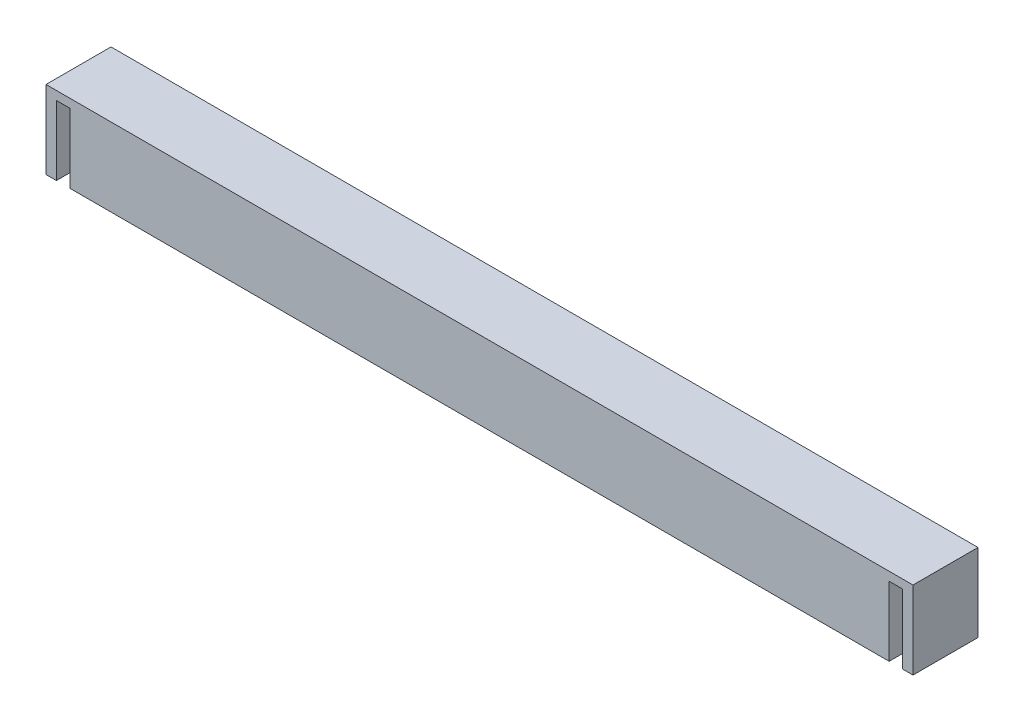
ISO-10303-21;
HEADER;
FILE_DESCRIPTION(('STEP AP214'),'2;1');
FILE_NAME('part.step','',(''),(''),'','','');
FILE_SCHEMA(('AUTOMOTIVE_DESIGN { 1 0 10303 214 1 1 1 1 }'));
ENDSEC;
DATA;
#1=APPLICATION_CONTEXT('core data for automotive mechanical design processes');
#2=APPLICATION_PROTOCOL_DEFINITION('international standard','automotive_design',2000,#1);
#3=PRODUCT_CONTEXT('',#1,'mechanical');
#4=PRODUCT('Part','Part','',(#3));
#5=PRODUCT_RELATED_PRODUCT_CATEGORY('part','',(#4));
#6=PRODUCT_DEFINITION_FORMATION('','',#4);
#7=PRODUCT_DEFINITION_CONTEXT('part definition',#1,'design');
#8=PRODUCT_DEFINITION('design','',#6,#7);
#9=PRODUCT_DEFINITION_SHAPE('','',#8);
#10=(LENGTH_UNIT() NAMED_UNIT(*) SI_UNIT(.MILLI.,.METRE.));
#11=(NAMED_UNIT(*) PLANE_ANGLE_UNIT() SI_UNIT($,.RADIAN.));
#12=(NAMED_UNIT(*) SI_UNIT($,.STERADIAN.) SOLID_ANGLE_UNIT());
#13=UNCERTAINTY_MEASURE_WITH_UNIT(LENGTH_MEASURE(1.E-05),#10,'distance_accuracy_value','');
#14=(GEOMETRIC_REPRESENTATION_CONTEXT(3) GLOBAL_UNCERTAINTY_ASSIGNED_CONTEXT((#13)) GLOBAL_UNIT_ASSIGNED_CONTEXT((#10,
#11,#12)) REPRESENTATION_CONTEXT('',''));
#15=CARTESIAN_POINT('',(0.,0.,0.));
#16=DIRECTION('',(0.,0.,1.));
#17=DIRECTION('',(1.,0.,0.));
#18=AXIS2_PLACEMENT_3D('',#15,#16,#17);
#19=CARTESIAN_POINT('',(-97.6,16.,7.5));
#20=DIRECTION('',(-1.,0.,0.));
#21=DIRECTION('',(0.,0.,1.));
#22=AXIS2_PLACEMENT_3D('',#19,#20,#21);
#23=PLANE('',#22);
#24=DIRECTION('',(0.,0.,-1.));
#25=VECTOR('',#24,1.);
#26=CARTESIAN_POINT('',(-97.6,0.,7.5));
#27=LINE('',#26,#25);
#28=CARTESIAN_POINT('',(-97.6,0.,7.5));
#29=VERTEX_POINT('',#28);
#30=CARTESIAN_POINT('',(-97.6,0.,2.5));
#31=VERTEX_POINT('',#30);
#32=EDGE_CURVE('E56',#29,#31,#27,.T.);
#33=ORIENTED_EDGE('',*,*,#32,.T.);
#34=DIRECTION('',(0.,1.,0.));
#35=VECTOR('',#34,1.);
#36=CARTESIAN_POINT('',(-97.6,16.,2.5));
#37=LINE('',#36,#35);
#38=CARTESIAN_POINT('',(-97.6,16.,2.5));
#39=VERTEX_POINT('',#38);
#40=EDGE_CURVE('E281',#31,#39,#37,.T.);
#41=ORIENTED_EDGE('',*,*,#40,.T.);
#42=DIRECTION('',(0.,0.,-1.));
#43=VECTOR('',#42,1.);
#44=CARTESIAN_POINT('',(-97.6,16.,7.5));
#45=LINE('',#44,#43);
#46=CARTESIAN_POINT('',(-97.6,16.,7.5));
#47=VERTEX_POINT('',#46);
#48=EDGE_CURVE('E256',#47,#39,#45,.T.);
#49=ORIENTED_EDGE('',*,*,#48,.F.);
#50=DIRECTION('',(0.,-1.,0.));
#51=VECTOR('',#50,1.);
#52=CARTESIAN_POINT('',(-97.6,16.,7.5));
#53=LINE('',#52,#51);
#54=EDGE_CURVE('E224',#47,#29,#53,.T.);
#55=ORIENTED_EDGE('',*,*,#54,.T.);
#56=EDGE_LOOP('',(#33,#41,#49,#55));
#57=FACE_BOUND('',#56,.T.);
#58=ADVANCED_FACE('F33',(#57),#23,.F.);
#59=CARTESIAN_POINT('',(-94.5,16.,7.5));
#60=DIRECTION('',(1.,0.,0.));
#61=DIRECTION('',(0.,0.,-1.));
#62=AXIS2_PLACEMENT_3D('',#59,#60,#61);
#63=PLANE('',#62);
#64=DIRECTION('',(0.,0.,1.));
#65=VECTOR('',#64,1.);
#66=CARTESIAN_POINT('',(-94.5,16.,7.5));
#67=LINE('',#66,#65);
#68=CARTESIAN_POINT('',(-94.5,16.,2.5));
#69=VERTEX_POINT('',#68);
#70=CARTESIAN_POINT('',(-94.5,16.,7.5));
#71=VERTEX_POINT('',#70);
#72=EDGE_CURVE('E252',#69,#71,#67,.T.);
#73=ORIENTED_EDGE('',*,*,#72,.F.);
#74=DIRECTION('',(0.,-1.,0.));
#75=VECTOR('',#74,1.);
#76=CARTESIAN_POINT('',(-94.5,16.,2.5));
#77=LINE('',#76,#75);
#78=CARTESIAN_POINT('',(-94.5,0.,2.5));
#79=VERTEX_POINT('',#78);
#80=EDGE_CURVE('E283',#69,#79,#77,.T.);
#81=ORIENTED_EDGE('',*,*,#80,.T.);
#82=DIRECTION('',(0.,0.,1.));
#83=VECTOR('',#82,1.);
#84=CARTESIAN_POINT('',(-94.5,0.,7.5));
#85=LINE('',#84,#83);
#86=CARTESIAN_POINT('',(-94.5,0.,7.5));
#87=VERTEX_POINT('',#86);
#88=EDGE_CURVE('E245',#79,#87,#85,.T.);
#89=ORIENTED_EDGE('',*,*,#88,.T.);
#90=DIRECTION('',(0.,-1.,0.));
#91=VECTOR('',#90,1.);
#92=CARTESIAN_POINT('',(-94.5,16.,7.5));
#93=LINE('',#92,#91);
#94=EDGE_CURVE('E238',#71,#87,#93,.T.);
#95=ORIENTED_EDGE('',*,*,#94,.F.);
#96=EDGE_LOOP('',(#73,#81,#89,#95));
#97=FACE_BOUND('',#96,.T.);
#98=ADVANCED_FACE('F323',(#97),#63,.F.);
#99=CARTESIAN_POINT('',(0.,16.,0.));
#100=DIRECTION('',(0.,-1.,0.));
#101=DIRECTION('',(0.,0.,-1.));
#102=AXIS2_PLACEMENT_3D('',#99,#100,#101);
#103=PLANE('',#102);
#104=DIRECTION('',(-1.,0.,0.));
#105=VECTOR('',#104,1.);
#106=CARTESIAN_POINT('',(0.,16.,2.5));
#107=LINE('',#106,#105);
#108=EDGE_CURVE('E285',#69,#39,#107,.T.);
#109=ORIENTED_EDGE('',*,*,#108,.F.);
#110=ORIENTED_EDGE('',*,*,#72,.T.);
#111=DIRECTION('',(-1.,0.,0.));
#112=VECTOR('',#111,1.);
#113=CARTESIAN_POINT('',(-97.6,16.,7.5));
#114=LINE('',#113,#112);
#115=EDGE_CURVE('E235',#71,#47,#114,.T.);
#116=ORIENTED_EDGE('',*,*,#115,.T.);
#117=ORIENTED_EDGE('',*,*,#48,.T.);
#118=EDGE_LOOP('',(#109,#110,#116,#117));
#119=FACE_BOUND('',#118,.T.);
#120=ADVANCED_FACE('F330',(#119),#103,.T.);
#121=CARTESIAN_POINT('',(94.5,16.,7.5));
#122=DIRECTION('',(-1.,0.,0.));
#123=DIRECTION('',(0.,0.,1.));
#124=AXIS2_PLACEMENT_3D('',#121,#122,#123);
#125=PLANE('',#124);
#126=DIRECTION('',(0.,0.,-1.));
#127=VECTOR('',#126,1.);
#128=CARTESIAN_POINT('',(94.5,0.,7.5));
#129=LINE('',#128,#127);
#130=CARTESIAN_POINT('',(94.5,0.,7.5));
#131=VERTEX_POINT('',#130);
#132=CARTESIAN_POINT('',(94.5,0.,2.5));
#133=VERTEX_POINT('',#132);
#134=EDGE_CURVE('E272',#131,#133,#129,.T.);
#135=ORIENTED_EDGE('',*,*,#134,.T.);
#136=DIRECTION('',(0.,1.,0.));
#137=VECTOR('',#136,1.);
#138=CARTESIAN_POINT('',(94.5,16.,2.5));
#139=LINE('',#138,#137);
#140=CARTESIAN_POINT('',(94.5,16.,2.5));
#141=VERTEX_POINT('',#140);
#142=EDGE_CURVE('E288',#133,#141,#139,.T.);
#143=ORIENTED_EDGE('',*,*,#142,.T.);
#144=DIRECTION('',(0.,0.,-1.));
#145=VECTOR('',#144,1.);
#146=CARTESIAN_POINT('',(94.5,16.,7.5));
#147=LINE('',#146,#145);
#148=CARTESIAN_POINT('',(94.5,16.,7.5));
#149=VERTEX_POINT('',#148);
#150=EDGE_CURVE('E278',#149,#141,#147,.T.);
#151=ORIENTED_EDGE('',*,*,#150,.F.);
#152=DIRECTION('',(0.,-1.,0.));
#153=VECTOR('',#152,1.);
#154=CARTESIAN_POINT('',(94.5,16.,7.5));
#155=LINE('',#154,#153);
#156=EDGE_CURVE('E267',#149,#131,#155,.T.);
#157=ORIENTED_EDGE('',*,*,#156,.T.);
#158=EDGE_LOOP('',(#135,#143,#151,#157));
#159=FACE_BOUND('',#158,.T.);
#160=ADVANCED_FACE('F372',(#159),#125,.F.);
#161=CARTESIAN_POINT('',(97.6,16.,7.5));
#162=DIRECTION('',(1.,0.,0.));
#163=DIRECTION('',(0.,0.,-1.));
#164=AXIS2_PLACEMENT_3D('',#161,#162,#163);
#165=PLANE('',#164);
#166=DIRECTION('',(0.,0.,1.));
#167=VECTOR('',#166,1.);
#168=CARTESIAN_POINT('',(97.6,16.,7.5));
#169=LINE('',#168,#167);
#170=CARTESIAN_POINT('',(97.6,16.,2.5));
#171=VERTEX_POINT('',#170);
#172=CARTESIAN_POINT('',(97.6,16.,7.5));
#173=VERTEX_POINT('',#172);
#174=EDGE_CURVE('E180',#171,#173,#169,.T.);
#175=ORIENTED_EDGE('',*,*,#174,.F.);
#176=DIRECTION('',(0.,-1.,0.));
#177=VECTOR('',#176,1.);
#178=CARTESIAN_POINT('',(97.6,16.,2.5));
#179=LINE('',#178,#177);
#180=CARTESIAN_POINT('',(97.6,0.,2.5));
#181=VERTEX_POINT('',#180);
#182=EDGE_CURVE('E290',#171,#181,#179,.T.);
#183=ORIENTED_EDGE('',*,*,#182,.T.);
#184=DIRECTION('',(0.,0.,1.));
#185=VECTOR('',#184,1.);
#186=CARTESIAN_POINT('',(97.6,0.,7.5));
#187=LINE('',#186,#185);
#188=CARTESIAN_POINT('',(97.6,0.,7.5));
#189=VERTEX_POINT('',#188);
#190=EDGE_CURVE('E271',#181,#189,#187,.T.);
#191=ORIENTED_EDGE('',*,*,#190,.T.);
#192=DIRECTION('',(0.,-1.,0.));
#193=VECTOR('',#192,1.);
#194=CARTESIAN_POINT('',(97.6,16.,7.5));
#195=LINE('',#194,#193);
#196=EDGE_CURVE('E264',#173,#189,#195,.T.);
#197=ORIENTED_EDGE('',*,*,#196,.F.);
#198=EDGE_LOOP('',(#175,#183,#191,#197));
#199=FACE_BOUND('',#198,.T.);
#200=ADVANCED_FACE('F377',(#199),#165,.F.);
#201=CARTESIAN_POINT('',(0.,16.,0.));
#202=DIRECTION('',(0.,-1.,0.));
#203=DIRECTION('',(0.,0.,-1.));
#204=AXIS2_PLACEMENT_3D('',#201,#202,#203);
#205=PLANE('',#204);
#206=DIRECTION('',(-1.,0.,0.));
#207=VECTOR('',#206,1.);
#208=CARTESIAN_POINT('',(0.,16.,2.5));
#209=LINE('',#208,#207);
#210=EDGE_CURVE('E11',#171,#141,#209,.T.);
#211=ORIENTED_EDGE('',*,*,#210,.F.);
#212=ORIENTED_EDGE('',*,*,#174,.T.);
#213=DIRECTION('',(-1.,0.,0.));
#214=VECTOR('',#213,1.);
#215=CARTESIAN_POINT('',(94.5,16.,7.5));
#216=LINE('',#215,#214);
#217=EDGE_CURVE('E179',#173,#149,#216,.T.);
#218=ORIENTED_EDGE('',*,*,#217,.T.);
#219=ORIENTED_EDGE('',*,*,#150,.T.);
#220=EDGE_LOOP('',(#211,#212,#218,#219));
#221=FACE_BOUND('',#220,.T.);
#222=ADVANCED_FACE('F382',(#221),#205,.T.);
#223=CARTESIAN_POINT('',(100.,18.,-7.5));
#224=DIRECTION('',(-1.,0.,0.));
#225=DIRECTION('',(0.,0.,1.));
#226=AXIS2_PLACEMENT_3D('',#223,#224,#225);
#227=PLANE('',#226);
#228=DIRECTION('',(0.,-1.,0.));
#229=VECTOR('',#228,1.);
#230=CARTESIAN_POINT('',(100.,18.,-7.5));
#231=LINE('',#230,#229);
#232=CARTESIAN_POINT('',(100.,18.,-7.5));
#233=VERTEX_POINT('',#232);
#234=CARTESIAN_POINT('',(100.,0.,-7.5));
#235=VERTEX_POINT('',#234);
#236=EDGE_CURVE('E195',#233,#235,#231,.T.);
#237=ORIENTED_EDGE('',*,*,#236,.F.);
#238=DIRECTION('',(0.,0.,-1.));
#239=VECTOR('',#238,1.);
#240=CARTESIAN_POINT('',(100.,18.,-7.5));
#241=LINE('',#240,#239);
#242=CARTESIAN_POINT('',(100.,18.,7.5));
#243=VERTEX_POINT('',#242);
#244=EDGE_CURVE('E212',#243,#233,#241,.T.);
#245=ORIENTED_EDGE('',*,*,#244,.F.);
#246=DIRECTION('',(0.,-1.,0.));
#247=VECTOR('',#246,1.);
#248=CARTESIAN_POINT('',(100.,18.,7.5));
#249=LINE('',#248,#247);
#250=CARTESIAN_POINT('',(100.,0.,7.5));
#251=VERTEX_POINT('',#250);
#252=EDGE_CURVE('E205',#243,#251,#249,.T.);
#253=ORIENTED_EDGE('',*,*,#252,.T.);
#254=DIRECTION('',(0.,0.,-1.));
#255=VECTOR('',#254,1.);
#256=CARTESIAN_POINT('',(100.,0.,-7.5));
#257=LINE('',#256,#255);
#258=EDGE_CURVE('E222',#251,#235,#257,.T.);
#259=ORIENTED_EDGE('',*,*,#258,.T.);
#260=EDGE_LOOP('',(#237,#245,#253,#259));
#261=FACE_BOUND('',#260,.T.);
#262=ADVANCED_FACE('F35',(#261),#227,.F.);
#263=CARTESIAN_POINT('',(-100.,18.,-7.5));
#264=DIRECTION('',(0.,0.,1.));
#265=DIRECTION('',(1.,0.,0.));
#266=AXIS2_PLACEMENT_3D('',#263,#264,#265);
#267=PLANE('',#266);
#268=DIRECTION('',(1.,0.,0.));
#269=VECTOR('',#268,1.);
#270=CARTESIAN_POINT('',(94.5,16.,-7.5));
#271=LINE('',#270,#269);
#272=CARTESIAN_POINT('',(94.5,16.,-7.5));
#273=VERTEX_POINT('',#272);
#274=CARTESIAN_POINT('',(97.6,16.,-7.5));
#275=VERTEX_POINT('',#274);
#276=EDGE_CURVE('E176',#273,#275,#271,.T.);
#277=ORIENTED_EDGE('',*,*,#276,.F.);
#278=DIRECTION('',(0.,-1.,0.));
#279=VECTOR('',#278,1.);
#280=CARTESIAN_POINT('',(94.5,16.,-7.5));
#281=LINE('',#280,#279);
#282=CARTESIAN_POINT('',(94.5,0.,-7.5));
#283=VERTEX_POINT('',#282);
#284=EDGE_CURVE('E259',#273,#283,#281,.T.);
#285=ORIENTED_EDGE('',*,*,#284,.T.);
#286=DIRECTION('',(-1.,0.,0.));
#287=VECTOR('',#286,1.);
#288=CARTESIAN_POINT('',(-100.,0.,-7.5));
#289=LINE('',#288,#287);
#290=CARTESIAN_POINT('',(-94.5,0.,-7.5));
#291=VERTEX_POINT('',#290);
#292=EDGE_CURVE('E220',#283,#291,#289,.T.);
#293=ORIENTED_EDGE('',*,*,#292,.T.);
#294=DIRECTION('',(0.,-1.,0.));
#295=VECTOR('',#294,1.);
#296=CARTESIAN_POINT('',(-94.5,16.,-7.5));
#297=LINE('',#296,#295);
#298=CARTESIAN_POINT('',(-94.5,16.,-7.5));
#299=VERTEX_POINT('',#298);
#300=EDGE_CURVE('E234',#299,#291,#297,.T.);
#301=ORIENTED_EDGE('',*,*,#300,.F.);
#302=DIRECTION('',(1.,0.,0.));
#303=VECTOR('',#302,1.);
#304=CARTESIAN_POINT('',(-97.6,16.,-7.5));
#305=LINE('',#304,#303);
#306=CARTESIAN_POINT('',(-97.6,16.,-7.5));
#307=VERTEX_POINT('',#306);
#308=EDGE_CURVE('E253',#307,#299,#305,.T.);
#309=ORIENTED_EDGE('',*,*,#308,.F.);
#310=DIRECTION('',(0.,-1.,0.));
#311=VECTOR('',#310,1.);
#312=CARTESIAN_POINT('',(-97.6,16.,-7.5));
#313=LINE('',#312,#311);
#314=CARTESIAN_POINT('',(-97.6,0.,-7.5));
#315=VERTEX_POINT('',#314);
#316=EDGE_CURVE('E231',#307,#315,#313,.T.);
#317=ORIENTED_EDGE('',*,*,#316,.T.);
#318=CARTESIAN_POINT('',(-100.,0.,-7.5));
#319=VERTEX_POINT('',#318);
#320=EDGE_CURVE('E221',#315,#319,#289,.T.);
#321=ORIENTED_EDGE('',*,*,#320,.T.);
#322=DIRECTION('',(0.,-1.,0.));
#323=VECTOR('',#322,1.);
#324=CARTESIAN_POINT('',(-100.,18.,-7.5));
#325=LINE('',#324,#323);
#326=CARTESIAN_POINT('',(-100.,18.,-7.5));
#327=VERTEX_POINT('',#326);
#328=EDGE_CURVE('E197',#327,#319,#325,.T.);
#329=ORIENTED_EDGE('',*,*,#328,.F.);
#330=DIRECTION('',(-1.,0.,0.));
#331=VECTOR('',#330,1.);
#332=CARTESIAN_POINT('',(-100.,18.,-7.5));
#333=LINE('',#332,#331);
#334=EDGE_CURVE('E228',#233,#327,#333,.T.);
#335=ORIENTED_EDGE('',*,*,#334,.F.);
#336=ORIENTED_EDGE('',*,*,#236,.T.);
#337=CARTESIAN_POINT('',(97.6,0.,-7.5));
#338=VERTEX_POINT('',#337);
#339=EDGE_CURVE('E217',#235,#338,#289,.T.);
#340=ORIENTED_EDGE('',*,*,#339,.T.);
#341=DIRECTION('',(0.,-1.,0.));
#342=VECTOR('',#341,1.);
#343=CARTESIAN_POINT('',(97.6,16.,-7.5));
#344=LINE('',#343,#342);
#345=EDGE_CURVE('E262',#275,#338,#344,.T.);
#346=ORIENTED_EDGE('',*,*,#345,.F.);
#347=EDGE_LOOP('',(#277,#285,#293,#301,#309,#317,#321,#329,#335,#336,#340,#346));
#348=FACE_BOUND('',#347,.T.);
#349=ADVANCED_FACE('F361',(#348),#267,.F.);
#350=CARTESIAN_POINT('',(-100.,18.,-7.5));
#351=DIRECTION('',(1.,0.,0.));
#352=DIRECTION('',(0.,0.,-1.));
#353=AXIS2_PLACEMENT_3D('',#350,#351,#352);
#354=PLANE('',#353);
#355=DIRECTION('',(0.,0.,1.));
#356=VECTOR('',#355,1.);
#357=CARTESIAN_POINT('',(-100.,0.,-7.5));
#358=LINE('',#357,#356);
#359=CARTESIAN_POINT('',(-100.,0.,7.5));
#360=VERTEX_POINT('',#359);
#361=EDGE_CURVE('E215',#319,#360,#358,.T.);
#362=ORIENTED_EDGE('',*,*,#361,.T.);
#363=DIRECTION('',(0.,-1.,0.));
#364=VECTOR('',#363,1.);
#365=CARTESIAN_POINT('',(-100.,18.,7.5));
#366=LINE('',#365,#364);
#367=CARTESIAN_POINT('',(-100.,18.,7.5));
#368=VERTEX_POINT('',#367);
#369=EDGE_CURVE('E202',#368,#360,#366,.T.);
#370=ORIENTED_EDGE('',*,*,#369,.F.);
#371=DIRECTION('',(0.,0.,1.));
#372=VECTOR('',#371,1.);
#373=CARTESIAN_POINT('',(-100.,18.,-7.5));
#374=LINE('',#373,#372);
#375=EDGE_CURVE('E226',#327,#368,#374,.T.);
#376=ORIENTED_EDGE('',*,*,#375,.F.);
#377=ORIENTED_EDGE('',*,*,#328,.T.);
#378=EDGE_LOOP('',(#362,#370,#376,#377));
#379=FACE_BOUND('',#378,.T.);
#380=ADVANCED_FACE('F421',(#379),#354,.F.);
#381=CARTESIAN_POINT('',(-100.,18.,7.5));
#382=DIRECTION('',(0.,0.,-1.));
#383=DIRECTION('',(-1.,0.,0.));
#384=AXIS2_PLACEMENT_3D('',#381,#382,#383);
#385=PLANE('',#384);
#386=DIRECTION('',(1.,0.,0.));
#387=VECTOR('',#386,1.);
#388=CARTESIAN_POINT('',(-100.,0.,7.5));
#389=LINE('',#388,#387);
#390=EDGE_CURVE('E213',#87,#131,#389,.T.);
#391=ORIENTED_EDGE('',*,*,#390,.T.);
#392=ORIENTED_EDGE('',*,*,#156,.F.);
#393=ORIENTED_EDGE('',*,*,#217,.F.);
#394=ORIENTED_EDGE('',*,*,#196,.T.);
#395=EDGE_CURVE('E214',#189,#251,#389,.T.);
#396=ORIENTED_EDGE('',*,*,#395,.T.);
#397=ORIENTED_EDGE('',*,*,#252,.F.);
#398=DIRECTION('',(1.,0.,0.));
#399=VECTOR('',#398,1.);
#400=CARTESIAN_POINT('',(-100.,18.,7.5));
#401=LINE('',#400,#399);
#402=EDGE_CURVE('E208',#368,#243,#401,.T.);
#403=ORIENTED_EDGE('',*,*,#402,.F.);
#404=ORIENTED_EDGE('',*,*,#369,.T.);
#405=EDGE_CURVE('E209',#360,#29,#389,.T.);
#406=ORIENTED_EDGE('',*,*,#405,.T.);
#407=ORIENTED_EDGE('',*,*,#54,.F.);
#408=ORIENTED_EDGE('',*,*,#115,.F.);
#409=ORIENTED_EDGE('',*,*,#94,.T.);
#410=EDGE_LOOP('',(#391,#392,#393,#394,#396,#397,#403,#404,#406,#407,#408,#409));
#411=FACE_BOUND('',#410,.T.);
#412=ADVANCED_FACE('F326',(#411),#385,.F.);
#413=CARTESIAN_POINT('',(0.,18.,0.));
#414=DIRECTION('',(0.,1.,0.));
#415=DIRECTION('',(0.,0.,1.));
#416=AXIS2_PLACEMENT_3D('',#413,#414,#415);
#417=PLANE('',#416);
#418=ORIENTED_EDGE('',*,*,#375,.T.);
#419=ORIENTED_EDGE('',*,*,#402,.T.);
#420=ORIENTED_EDGE('',*,*,#244,.T.);
#421=ORIENTED_EDGE('',*,*,#334,.T.);
#422=EDGE_LOOP('',(#418,#419,#420,#421));
#423=FACE_BOUND('',#422,.T.);
#424=ADVANCED_FACE('F347',(#423),#417,.T.);
#425=CARTESIAN_POINT('',(0.,0.,0.));
#426=DIRECTION('',(0.,1.,0.));
#427=DIRECTION('',(0.,0.,1.));
#428=AXIS2_PLACEMENT_3D('',#425,#426,#427);
#429=PLANE('',#428);
#430=ORIENTED_EDGE('',*,*,#339,.F.);
#431=ORIENTED_EDGE('',*,*,#258,.F.);
#432=ORIENTED_EDGE('',*,*,#395,.F.);
#433=ORIENTED_EDGE('',*,*,#190,.F.);
#434=DIRECTION('',(1.,0.,0.));
#435=VECTOR('',#434,1.);
#436=CARTESIAN_POINT('',(-100.,0.,2.5));
#437=LINE('',#436,#435);
#438=EDGE_CURVE('E300',#133,#181,#437,.T.);
#439=ORIENTED_EDGE('',*,*,#438,.F.);
#440=ORIENTED_EDGE('',*,*,#134,.F.);
#441=ORIENTED_EDGE('',*,*,#390,.F.);
#442=ORIENTED_EDGE('',*,*,#88,.F.);
#443=EDGE_CURVE('E303',#31,#79,#437,.T.);
#444=ORIENTED_EDGE('',*,*,#443,.F.);
#445=ORIENTED_EDGE('',*,*,#32,.F.);
#446=ORIENTED_EDGE('',*,*,#405,.F.);
#447=ORIENTED_EDGE('',*,*,#361,.F.);
#448=ORIENTED_EDGE('',*,*,#320,.F.);
#449=CARTESIAN_POINT('',(-97.6,0.,-2.5));
#450=VERTEX_POINT('',#449);
#451=EDGE_CURVE('E247',#450,#315,#27,.T.);
#452=ORIENTED_EDGE('',*,*,#451,.F.);
#453=DIRECTION('',(1.,0.,0.));
#454=VECTOR('',#453,1.);
#455=CARTESIAN_POINT('',(-100.,0.,-2.5));
#456=LINE('',#455,#454);
#457=CARTESIAN_POINT('',(-94.5,0.,-2.5));
#458=VERTEX_POINT('',#457);
#459=EDGE_CURVE('E191',#450,#458,#456,.T.);
#460=ORIENTED_EDGE('',*,*,#459,.T.);
#461=EDGE_CURVE('E242',#291,#458,#85,.T.);
#462=ORIENTED_EDGE('',*,*,#461,.F.);
#463=ORIENTED_EDGE('',*,*,#292,.F.);
#464=CARTESIAN_POINT('',(94.5,0.,-2.5));
#465=VERTEX_POINT('',#464);
#466=EDGE_CURVE('E274',#465,#283,#129,.T.);
#467=ORIENTED_EDGE('',*,*,#466,.F.);
#468=CARTESIAN_POINT('',(97.6,0.,-2.5));
#469=VERTEX_POINT('',#468);
#470=EDGE_CURVE('E304',#465,#469,#456,.T.);
#471=ORIENTED_EDGE('',*,*,#470,.T.);
#472=EDGE_CURVE('E186',#338,#469,#187,.T.);
#473=ORIENTED_EDGE('',*,*,#472,.F.);
#474=EDGE_LOOP('',(#430,#431,#432,#433,#439,#440,#441,#442,#444,#445,#446,#447,#448,#452,#460,
#462,#463,#467,#471,#473));
#475=FACE_BOUND('',#474,.T.);
#476=ADVANCED_FACE('F315',(#475),#429,.F.);
#477=CARTESIAN_POINT('',(-97.6,16.,-2.5));
#478=VERTEX_POINT('',#477);
#479=EDGE_CURVE('E244',#478,#307,#45,.T.);
#480=ORIENTED_EDGE('',*,*,#479,.F.);
#481=DIRECTION('',(0.,-1.,0.));
#482=VECTOR('',#481,1.);
#483=CARTESIAN_POINT('',(-97.6,16.,-2.5));
#484=LINE('',#483,#482);
#485=EDGE_CURVE('E48',#478,#450,#484,.T.);
#486=ORIENTED_EDGE('',*,*,#485,.T.);
#487=ORIENTED_EDGE('',*,*,#451,.T.);
#488=ORIENTED_EDGE('',*,*,#316,.F.);
#489=EDGE_LOOP('',(#480,#486,#487,#488));
#490=FACE_BOUND('',#489,.T.);
#491=ADVANCED_FACE('F333',(#490),#23,.F.);
#492=ORIENTED_EDGE('',*,*,#461,.T.);
#493=DIRECTION('',(0.,1.,0.));
#494=VECTOR('',#493,1.);
#495=CARTESIAN_POINT('',(-94.5,16.,-2.5));
#496=LINE('',#495,#494);
#497=CARTESIAN_POINT('',(-94.5,16.,-2.5));
#498=VERTEX_POINT('',#497);
#499=EDGE_CURVE('E293',#458,#498,#496,.T.);
#500=ORIENTED_EDGE('',*,*,#499,.T.);
#501=EDGE_CURVE('E250',#299,#498,#67,.T.);
#502=ORIENTED_EDGE('',*,*,#501,.F.);
#503=ORIENTED_EDGE('',*,*,#300,.T.);
#504=EDGE_LOOP('',(#492,#500,#502,#503));
#505=FACE_BOUND('',#504,.T.);
#506=ADVANCED_FACE('F338',(#505),#63,.F.);
#507=DIRECTION('',(1.,0.,0.));
#508=VECTOR('',#507,1.);
#509=CARTESIAN_POINT('',(0.,16.,-2.5));
#510=LINE('',#509,#508);
#511=EDGE_CURVE('E296',#478,#498,#510,.T.);
#512=ORIENTED_EDGE('',*,*,#511,.F.);
#513=ORIENTED_EDGE('',*,*,#479,.T.);
#514=ORIENTED_EDGE('',*,*,#308,.T.);
#515=ORIENTED_EDGE('',*,*,#501,.T.);
#516=EDGE_LOOP('',(#512,#513,#514,#515));
#517=FACE_BOUND('',#516,.T.);
#518=ADVANCED_FACE('F345',(#517),#103,.T.);
#519=CARTESIAN_POINT('',(94.5,16.,-2.5));
#520=VERTEX_POINT('',#519);
#521=EDGE_CURVE('E270',#520,#273,#147,.T.);
#522=ORIENTED_EDGE('',*,*,#521,.F.);
#523=DIRECTION('',(0.,-1.,0.));
#524=VECTOR('',#523,1.);
#525=CARTESIAN_POINT('',(94.5,16.,-2.5));
#526=LINE('',#525,#524);
#527=EDGE_CURVE('E190',#520,#465,#526,.T.);
#528=ORIENTED_EDGE('',*,*,#527,.T.);
#529=ORIENTED_EDGE('',*,*,#466,.T.);
#530=ORIENTED_EDGE('',*,*,#284,.F.);
#531=EDGE_LOOP('',(#522,#528,#529,#530));
#532=FACE_BOUND('',#531,.T.);
#533=ADVANCED_FACE('F365',(#532),#125,.F.);
#534=ORIENTED_EDGE('',*,*,#472,.T.);
#535=DIRECTION('',(0.,1.,0.));
#536=VECTOR('',#535,1.);
#537=CARTESIAN_POINT('',(97.6,16.,-2.5));
#538=LINE('',#537,#536);
#539=CARTESIAN_POINT('',(97.6,16.,-2.5));
#540=VERTEX_POINT('',#539);
#541=EDGE_CURVE('E183',#469,#540,#538,.T.);
#542=ORIENTED_EDGE('',*,*,#541,.T.);
#543=EDGE_CURVE('E170',#275,#540,#169,.T.);
#544=ORIENTED_EDGE('',*,*,#543,.F.);
#545=ORIENTED_EDGE('',*,*,#345,.T.);
#546=EDGE_LOOP('',(#534,#542,#544,#545));
#547=FACE_BOUND('',#546,.T.);
#548=ADVANCED_FACE('F184',(#547),#165,.F.);
#549=DIRECTION('',(1.,0.,0.));
#550=VECTOR('',#549,1.);
#551=CARTESIAN_POINT('',(0.,16.,-2.5));
#552=LINE('',#551,#550);
#553=EDGE_CURVE('E41',#520,#540,#552,.T.);
#554=ORIENTED_EDGE('',*,*,#553,.F.);
#555=ORIENTED_EDGE('',*,*,#521,.T.);
#556=ORIENTED_EDGE('',*,*,#276,.T.);
#557=ORIENTED_EDGE('',*,*,#543,.T.);
#558=EDGE_LOOP('',(#554,#555,#556,#557));
#559=FACE_BOUND('',#558,.T.);
#560=ADVANCED_FACE('F172',(#559),#205,.T.);
#561=CARTESIAN_POINT('',(-100.,0.,2.5));
#562=DIRECTION('',(0.,0.,1.));
#563=DIRECTION('',(1.,0.,0.));
#564=AXIS2_PLACEMENT_3D('',#561,#562,#563);
#565=PLANE('',#564);
#566=ORIENTED_EDGE('',*,*,#142,.F.);
#567=ORIENTED_EDGE('',*,*,#438,.T.);
#568=ORIENTED_EDGE('',*,*,#182,.F.);
#569=ORIENTED_EDGE('',*,*,#210,.T.);
#570=EDGE_LOOP('',(#566,#567,#568,#569));
#571=FACE_BOUND('',#570,.T.);
#572=ADVANCED_FACE('F389',(#571),#565,.T.);
#573=CARTESIAN_POINT('',(-100.,0.,-2.5));
#574=DIRECTION('',(0.,0.,-1.));
#575=DIRECTION('',(-1.,0.,0.));
#576=AXIS2_PLACEMENT_3D('',#573,#574,#575);
#577=PLANE('',#576);
#578=ORIENTED_EDGE('',*,*,#527,.F.);
#579=ORIENTED_EDGE('',*,*,#553,.T.);
#580=ORIENTED_EDGE('',*,*,#541,.F.);
#581=ORIENTED_EDGE('',*,*,#470,.F.);
#582=EDGE_LOOP('',(#578,#579,#580,#581));
#583=FACE_BOUND('',#582,.T.);
#584=ADVANCED_FACE('F194',(#583),#577,.T.);
#585=ORIENTED_EDGE('',*,*,#40,.F.);
#586=ORIENTED_EDGE('',*,*,#443,.T.);
#587=ORIENTED_EDGE('',*,*,#80,.F.);
#588=ORIENTED_EDGE('',*,*,#108,.T.);
#589=EDGE_LOOP('',(#585,#586,#587,#588));
#590=FACE_BOUND('',#589,.T.);
#591=ADVANCED_FACE('F312',(#590),#565,.T.);
#592=ORIENTED_EDGE('',*,*,#485,.F.);
#593=ORIENTED_EDGE('',*,*,#511,.T.);
#594=ORIENTED_EDGE('',*,*,#499,.F.);
#595=ORIENTED_EDGE('',*,*,#459,.F.);
#596=EDGE_LOOP('',(#592,#593,#594,#595));
#597=FACE_BOUND('',#596,.T.);
#598=ADVANCED_FACE('F354',(#597),#577,.T.);
#599=CLOSED_SHELL('',(#58,#98,#120,#160,#200,#222,#262,#349,#380,#412,#424,#476,#491,#506,#518,
#533,#548,#560,#572,#584,#591,#598));
#600=MANIFOLD_SOLID_BREP('B2',#599);
#601=ADVANCED_BREP_SHAPE_REPRESENTATION('',(#18,#600),#14);
#602=SHAPE_DEFINITION_REPRESENTATION(#9,#601);
ENDSEC;
END-ISO-10303-21;
